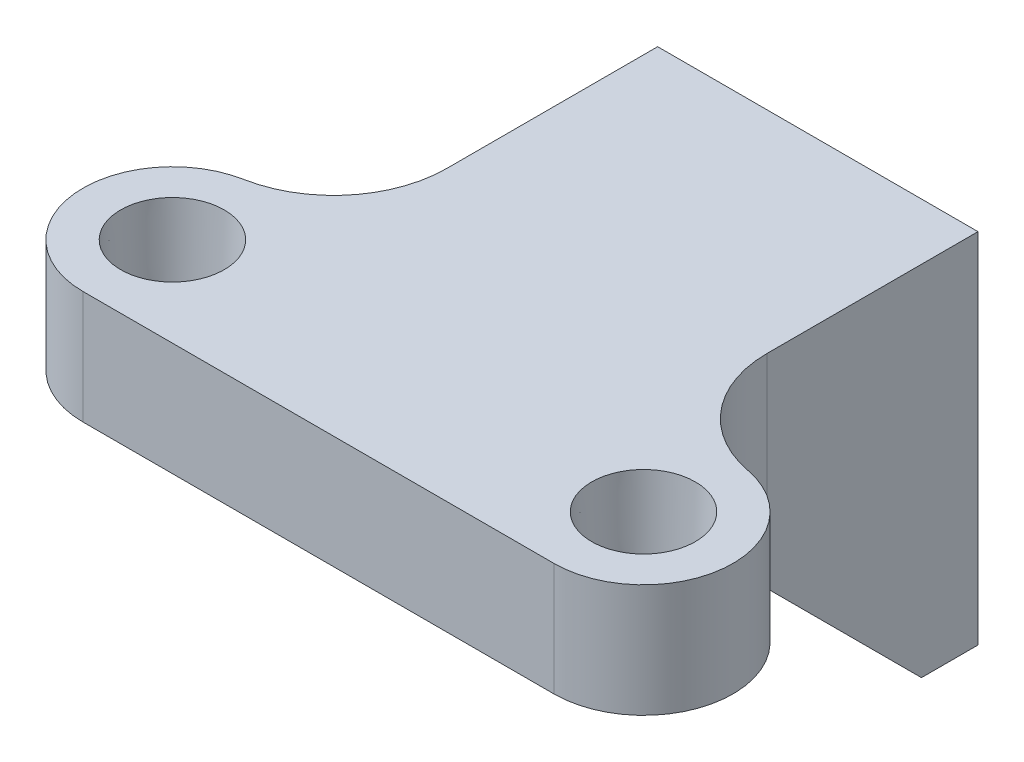
ISO-10303-21;
HEADER;
FILE_DESCRIPTION(('STEP AP214'),'2;1');
FILE_NAME('part.step','',(''),(''),'','','');
FILE_SCHEMA(('AUTOMOTIVE_DESIGN { 1 0 10303 214 1 1 1 1 }'));
ENDSEC;
DATA;
#1=APPLICATION_CONTEXT('core data for automotive mechanical design processes');
#2=APPLICATION_PROTOCOL_DEFINITION('international standard','automotive_design',2000,#1);
#3=PRODUCT_CONTEXT('',#1,'mechanical');
#4=PRODUCT('Part','Part','',(#3));
#5=PRODUCT_RELATED_PRODUCT_CATEGORY('part','',(#4));
#6=PRODUCT_DEFINITION_FORMATION('','',#4);
#7=PRODUCT_DEFINITION_CONTEXT('part definition',#1,'design');
#8=PRODUCT_DEFINITION('design','',#6,#7);
#9=PRODUCT_DEFINITION_SHAPE('','',#8);
#10=(LENGTH_UNIT() NAMED_UNIT(*) SI_UNIT(.MILLI.,.METRE.));
#11=(NAMED_UNIT(*) PLANE_ANGLE_UNIT() SI_UNIT($,.RADIAN.));
#12=(NAMED_UNIT(*) SI_UNIT($,.STERADIAN.) SOLID_ANGLE_UNIT());
#13=UNCERTAINTY_MEASURE_WITH_UNIT(LENGTH_MEASURE(1.E-05),#10,'distance_accuracy_value','');
#14=(GEOMETRIC_REPRESENTATION_CONTEXT(3) GLOBAL_UNCERTAINTY_ASSIGNED_CONTEXT((#13)) GLOBAL_UNIT_ASSIGNED_CONTEXT((#10,
#11,#12)) REPRESENTATION_CONTEXT('',''));
#15=CARTESIAN_POINT('',(0.,0.,0.));
#16=DIRECTION('',(0.,0.,1.));
#17=DIRECTION('',(1.,0.,0.));
#18=AXIS2_PLACEMENT_3D('',#15,#16,#17);
#19=CARTESIAN_POINT('',(-12.5,0.,4.75));
#20=DIRECTION('',(0.,1.,0.));
#21=DIRECTION('',(0.,0.,1.));
#22=AXIS2_PLACEMENT_3D('',#19,#20,#21);
#23=PLANE('',#22);
#24=CARTESIAN_POINT('',(-12.5,0.,4.75));
#25=DIRECTION('',(0.,1.,0.));
#26=DIRECTION('',(0.,0.,1.));
#27=AXIS2_PLACEMENT_3D('',#24,#25,#26);
#28=CIRCLE('',#27,4.74999999999999);
#29=CARTESIAN_POINT('',(-13.3837209302326,0.,0.0829305428921593));
#30=VERTEX_POINT('',#29);
#31=CARTESIAN_POINT('',(-12.5,0.,9.49999999999999));
#32=VERTEX_POINT('',#31);
#33=EDGE_CURVE('E239',#30,#32,#28,.T.);
#34=ORIENTED_EDGE('',*,*,#33,.F.);
#35=CARTESIAN_POINT('',(-14.5,0.,-5.8123150871388));
#36=DIRECTION('',(0.,1.,0.));
#37=DIRECTION('',(0.,0.,1.));
#38=AXIS2_PLACEMENT_3D('',#35,#36,#37);
#39=CIRCLE('',#38,6.);
#40=CARTESIAN_POINT('',(-12.4549994378833,0.,-0.171572875253678));
#41=VERTEX_POINT('',#40);
#42=EDGE_CURVE('E339',#30,#41,#39,.T.);
#43=ORIENTED_EDGE('',*,*,#42,.T.);
#44=DIRECTION('',(1.,0.,0.));
#45=VECTOR('',#44,1.);
#46=CARTESIAN_POINT('',(-12.5,0.,-0.171572875253678));
#47=LINE('',#46,#45);
#48=CARTESIAN_POINT('',(-4.5,0.,-0.171572875253678));
#49=VERTEX_POINT('',#48);
#50=EDGE_CURVE('E288',#41,#49,#47,.T.);
#51=ORIENTED_EDGE('',*,*,#50,.T.);
#52=DIRECTION('',(0.,0.,1.));
#53=VECTOR('',#52,1.);
#54=CARTESIAN_POINT('',(-4.5,0.,4.75));
#55=LINE('',#54,#53);
#56=CARTESIAN_POINT('',(-4.5,0.,-12.));
#57=VERTEX_POINT('',#56);
#58=EDGE_CURVE('E286',#49,#57,#55,.F.);
#59=ORIENTED_EDGE('',*,*,#58,.T.);
#60=DIRECTION('',(1.,0.,0.));
#61=VECTOR('',#60,1.);
#62=CARTESIAN_POINT('',(6.5,0.,-12.));
#63=LINE('',#62,#61);
#64=CARTESIAN_POINT('',(4.5,0.,-12.));
#65=VERTEX_POINT('',#64);
#66=EDGE_CURVE('E281',#57,#65,#63,.T.);
#67=ORIENTED_EDGE('',*,*,#66,.T.);
#68=DIRECTION('',(0.,0.,1.));
#69=VECTOR('',#68,1.);
#70=CARTESIAN_POINT('',(4.5,0.,4.75));
#71=LINE('',#70,#69);
#72=CARTESIAN_POINT('',(4.5,0.,-0.171572875253677));
#73=VERTEX_POINT('',#72);
#74=EDGE_CURVE('E283',#65,#73,#71,.T.);
#75=ORIENTED_EDGE('',*,*,#74,.T.);
#76=DIRECTION('',(-1.,0.,0.));
#77=VECTOR('',#76,1.);
#78=CARTESIAN_POINT('',(8.5,0.,-0.171572875253677));
#79=LINE('',#78,#77);
#80=CARTESIAN_POINT('',(12.4549994378834,0.,-0.171572875253677));
#81=VERTEX_POINT('',#80);
#82=EDGE_CURVE('E52',#73,#81,#79,.F.);
#83=ORIENTED_EDGE('',*,*,#82,.T.);
#84=CARTESIAN_POINT('',(14.5,0.,-5.81231508713881));
#85=DIRECTION('',(0.,1.,0.));
#86=DIRECTION('',(0.,0.,1.));
#87=AXIS2_PLACEMENT_3D('',#84,#85,#86);
#88=CIRCLE('',#87,6.);
#89=CARTESIAN_POINT('',(13.3837209302326,0.,0.0829305428921515));
#90=VERTEX_POINT('',#89);
#91=EDGE_CURVE('E45',#81,#90,#88,.T.);
#92=ORIENTED_EDGE('',*,*,#91,.T.);
#93=CARTESIAN_POINT('',(12.5,0.,4.74999999999999));
#94=DIRECTION('',(0.,1.,0.));
#95=DIRECTION('',(0.,0.,1.));
#96=AXIS2_PLACEMENT_3D('',#93,#94,#95);
#97=CIRCLE('',#96,4.74999999999999);
#98=CARTESIAN_POINT('',(12.5,0.,9.49999999999998));
#99=VERTEX_POINT('',#98);
#100=EDGE_CURVE('E243',#99,#90,#97,.T.);
#101=ORIENTED_EDGE('',*,*,#100,.F.);
#102=DIRECTION('',(1.,0.,0.));
#103=VECTOR('',#102,1.);
#104=CARTESIAN_POINT('',(-12.5,0.,9.49999999999999));
#105=LINE('',#104,#103);
#106=EDGE_CURVE('E254',#32,#99,#105,.T.);
#107=ORIENTED_EDGE('',*,*,#106,.F.);
#108=EDGE_LOOP('',(#34,#43,#51,#59,#67,#75,#83,#92,#101,#107));
#109=FACE_BOUND('',#108,.T.);
#110=CARTESIAN_POINT('',(-12.5,0.,4.75));
#111=DIRECTION('',(0.,1.,0.));
#112=DIRECTION('',(0.,0.,1.));
#113=AXIS2_PLACEMENT_3D('',#110,#111,#112);
#114=CIRCLE('',#113,1.6);
#115=CARTESIAN_POINT('',(-12.5,0.,6.35));
#116=VERTEX_POINT('',#115);
#117=EDGE_CURVE('E232',#116,#116,#114,.T.);
#118=ORIENTED_EDGE('',*,*,#117,.T.);
#119=EDGE_LOOP('',(#118));
#120=FACE_BOUND('',#119,.T.);
#121=CARTESIAN_POINT('',(12.5,0.,4.74999999999999));
#122=DIRECTION('',(0.,1.,0.));
#123=DIRECTION('',(0.,0.,1.));
#124=AXIS2_PLACEMENT_3D('',#121,#122,#123);
#125=CIRCLE('',#124,1.6);
#126=CARTESIAN_POINT('',(12.5,0.,6.34999999999999));
#127=VERTEX_POINT('',#126);
#128=EDGE_CURVE('E235',#127,#127,#125,.T.);
#129=ORIENTED_EDGE('',*,*,#128,.T.);
#130=EDGE_LOOP('',(#129));
#131=FACE_BOUND('',#130,.T.);
#132=ADVANCED_FACE('F36',(#109,#120,#131),#23,.F.);
#133=CARTESIAN_POINT('',(-12.5,6.,4.75));
#134=DIRECTION('',(0.,-1.,0.));
#135=DIRECTION('',(0.,0.,-1.));
#136=AXIS2_PLACEMENT_3D('',#133,#134,#135);
#137=CYLINDRICAL_SURFACE('',#136,4.74999999999999);
#138=CARTESIAN_POINT('',(-12.5,6.,4.75));
#139=DIRECTION('',(0.,1.,0.));
#140=DIRECTION('',(0.,0.,1.));
#141=AXIS2_PLACEMENT_3D('',#138,#139,#140);
#142=CIRCLE('',#141,4.74999999999999);
#143=CARTESIAN_POINT('',(-13.3837209302326,6.,0.0829305428921593));
#144=VERTEX_POINT('',#143);
#145=CARTESIAN_POINT('',(-12.5,6.,9.49999999999999));
#146=VERTEX_POINT('',#145);
#147=EDGE_CURVE('E240',#144,#146,#142,.T.);
#148=ORIENTED_EDGE('',*,*,#147,.F.);
#149=DIRECTION('',(0.,-1.,0.));
#150=VECTOR('',#149,1.);
#151=CARTESIAN_POINT('',(-13.3837209302326,6.,0.0829305428921593));
#152=LINE('',#151,#150);
#153=EDGE_CURVE('E307',#144,#30,#152,.T.);
#154=ORIENTED_EDGE('',*,*,#153,.T.);
#155=ORIENTED_EDGE('',*,*,#33,.T.);
#156=DIRECTION('',(0.,-1.,0.));
#157=VECTOR('',#156,1.);
#158=CARTESIAN_POINT('',(-12.5,6.,9.49999999999999));
#159=LINE('',#158,#157);
#160=EDGE_CURVE('E262',#146,#32,#159,.T.);
#161=ORIENTED_EDGE('',*,*,#160,.F.);
#162=EDGE_LOOP('',(#148,#154,#155,#161));
#163=FACE_BOUND('',#162,.T.);
#164=ADVANCED_FACE('F409',(#163),#137,.T.);
#165=CARTESIAN_POINT('',(-12.5,6.,9.49999999999999));
#166=DIRECTION('',(0.,0.,-1.));
#167=DIRECTION('',(-1.,0.,0.));
#168=AXIS2_PLACEMENT_3D('',#165,#166,#167);
#169=PLANE('',#168);
#170=ORIENTED_EDGE('',*,*,#106,.T.);
#171=DIRECTION('',(0.,-1.,0.));
#172=VECTOR('',#171,1.);
#173=CARTESIAN_POINT('',(12.5,6.,9.49999999999998));
#174=LINE('',#173,#172);
#175=CARTESIAN_POINT('',(12.5,6.,9.49999999999998));
#176=VERTEX_POINT('',#175);
#177=EDGE_CURVE('E259',#176,#99,#174,.T.);
#178=ORIENTED_EDGE('',*,*,#177,.F.);
#179=DIRECTION('',(1.,0.,0.));
#180=VECTOR('',#179,1.);
#181=CARTESIAN_POINT('',(-12.5,6.,9.49999999999999));
#182=LINE('',#181,#180);
#183=EDGE_CURVE('E242',#146,#176,#182,.T.);
#184=ORIENTED_EDGE('',*,*,#183,.F.);
#185=ORIENTED_EDGE('',*,*,#160,.T.);
#186=EDGE_LOOP('',(#170,#178,#184,#185));
#187=FACE_BOUND('',#186,.T.);
#188=ADVANCED_FACE('F412',(#187),#169,.F.);
#189=CARTESIAN_POINT('',(12.5,6.,4.74999999999999));
#190=DIRECTION('',(0.,-1.,0.));
#191=DIRECTION('',(0.,0.,-1.));
#192=AXIS2_PLACEMENT_3D('',#189,#190,#191);
#193=CYLINDRICAL_SURFACE('',#192,4.74999999999999);
#194=ORIENTED_EDGE('',*,*,#100,.T.);
#195=DIRECTION('',(0.,-1.,0.));
#196=VECTOR('',#195,1.);
#197=CARTESIAN_POINT('',(13.3837209302326,6.,0.0829305428921507));
#198=LINE('',#197,#196);
#199=CARTESIAN_POINT('',(13.3837209302326,6.,0.0829305428921515));
#200=VERTEX_POINT('',#199);
#201=EDGE_CURVE('E337',#90,#200,#198,.F.);
#202=ORIENTED_EDGE('',*,*,#201,.T.);
#203=CARTESIAN_POINT('',(12.5,6.,4.74999999999999));
#204=DIRECTION('',(0.,1.,0.));
#205=DIRECTION('',(0.,0.,1.));
#206=AXIS2_PLACEMENT_3D('',#203,#204,#205);
#207=CIRCLE('',#206,4.74999999999999);
#208=EDGE_CURVE('E245',#176,#200,#207,.T.);
#209=ORIENTED_EDGE('',*,*,#208,.F.);
#210=ORIENTED_EDGE('',*,*,#177,.T.);
#211=EDGE_LOOP('',(#194,#202,#209,#210));
#212=FACE_BOUND('',#211,.T.);
#213=ADVANCED_FACE('F385',(#212),#193,.T.);
#214=CARTESIAN_POINT('',(8.5,6.,0.));
#215=DIRECTION('',(-1.,0.,0.));
#216=DIRECTION('',(0.,0.,1.));
#217=AXIS2_PLACEMENT_3D('',#214,#215,#216);
#218=PLANE('',#217);
#219=DIRECTION('',(0.,0.,-1.));
#220=VECTOR('',#219,1.);
#221=CARTESIAN_POINT('',(8.5,6.,0.));
#222=LINE('',#221,#220);
#223=CARTESIAN_POINT('',(8.5,6.,-5.81231508713881));
#224=VERTEX_POINT('',#223);
#225=CARTESIAN_POINT('',(8.5,6.,-17.));
#226=VERTEX_POINT('',#225);
#227=EDGE_CURVE('E248',#224,#226,#222,.T.);
#228=ORIENTED_EDGE('',*,*,#227,.F.);
#229=DIRECTION('',(0.,1.,0.));
#230=VECTOR('',#229,1.);
#231=CARTESIAN_POINT('',(8.5,0.,-5.81231508713881));
#232=LINE('',#231,#230);
#233=CARTESIAN_POINT('',(8.5,-4.81231508713889,-5.81231508713881));
#234=VERTEX_POINT('',#233);
#235=EDGE_CURVE('E334',#224,#234,#232,.F.);
#236=ORIENTED_EDGE('',*,*,#235,.T.);
#237=DIRECTION('',(0.,-0.707106781186544,-0.707106781186551));
#238=VECTOR('',#237,1.);
#239=CARTESIAN_POINT('',(8.5,-13.,-14.));
#240=LINE('',#239,#238);
#241=CARTESIAN_POINT('',(8.5,-13.,-14.));
#242=VERTEX_POINT('',#241);
#243=EDGE_CURVE('E205',#234,#242,#240,.T.);
#244=ORIENTED_EDGE('',*,*,#243,.T.);
#245=DIRECTION('',(0.,0.,-1.));
#246=VECTOR('',#245,1.);
#247=CARTESIAN_POINT('',(8.5,-13.,-17.));
#248=LINE('',#247,#246);
#249=CARTESIAN_POINT('',(8.5,-13.,-17.));
#250=VERTEX_POINT('',#249);
#251=EDGE_CURVE('E207',#242,#250,#248,.T.);
#252=ORIENTED_EDGE('',*,*,#251,.T.);
#253=DIRECTION('',(0.,-1.,0.));
#254=VECTOR('',#253,1.);
#255=CARTESIAN_POINT('',(8.5,6.,-17.));
#256=LINE('',#255,#254);
#257=EDGE_CURVE('E178',#226,#250,#256,.T.);
#258=ORIENTED_EDGE('',*,*,#257,.F.);
#259=EDGE_LOOP('',(#228,#236,#244,#252,#258));
#260=FACE_BOUND('',#259,.T.);
#261=ADVANCED_FACE('F394',(#260),#218,.F.);
#262=CARTESIAN_POINT('',(-8.5,6.,-17.));
#263=DIRECTION('',(0.,0.,1.));
#264=DIRECTION('',(1.,0.,0.));
#265=AXIS2_PLACEMENT_3D('',#262,#263,#264);
#266=PLANE('',#265);
#267=DIRECTION('',(-1.,0.,0.));
#268=VECTOR('',#267,1.);
#269=CARTESIAN_POINT('',(6.5,-13.,-17.));
#270=LINE('',#269,#268);
#271=CARTESIAN_POINT('',(-8.5,-13.,-17.));
#272=VERTEX_POINT('',#271);
#273=EDGE_CURVE('E181',#250,#272,#270,.T.);
#274=ORIENTED_EDGE('',*,*,#273,.T.);
#275=DIRECTION('',(0.,-1.,0.));
#276=VECTOR('',#275,1.);
#277=CARTESIAN_POINT('',(-8.5,6.,-17.));
#278=LINE('',#277,#276);
#279=CARTESIAN_POINT('',(-8.5,6.,-17.));
#280=VERTEX_POINT('',#279);
#281=EDGE_CURVE('E168',#280,#272,#278,.T.);
#282=ORIENTED_EDGE('',*,*,#281,.F.);
#283=DIRECTION('',(-1.,0.,0.));
#284=VECTOR('',#283,1.);
#285=CARTESIAN_POINT('',(-8.5,6.,-17.));
#286=LINE('',#285,#284);
#287=EDGE_CURVE('E250',#226,#280,#286,.T.);
#288=ORIENTED_EDGE('',*,*,#287,.F.);
#289=ORIENTED_EDGE('',*,*,#257,.T.);
#290=EDGE_LOOP('',(#274,#282,#288,#289));
#291=FACE_BOUND('',#290,.T.);
#292=CARTESIAN_POINT('',(0.,-6.5,-17.));
#293=DIRECTION('',(0.,0.,1.));
#294=DIRECTION('',(1.,0.,0.));
#295=AXIS2_PLACEMENT_3D('',#292,#293,#294);
#296=CIRCLE('',#295,2.65);
#297=CARTESIAN_POINT('',(2.65,-6.5,-17.));
#298=VERTEX_POINT('',#297);
#299=EDGE_CURVE('E189',#298,#298,#296,.T.);
#300=ORIENTED_EDGE('',*,*,#299,.T.);
#301=EDGE_LOOP('',(#300));
#302=FACE_BOUND('',#301,.T.);
#303=ADVANCED_FACE('F182',(#291,#302),#266,.F.);
#304=CARTESIAN_POINT('',(-8.5,6.,0.));
#305=DIRECTION('',(1.,0.,0.));
#306=DIRECTION('',(0.,0.,-1.));
#307=AXIS2_PLACEMENT_3D('',#304,#305,#306);
#308=PLANE('',#307);
#309=DIRECTION('',(0.,-0.707106781186544,-0.707106781186551));
#310=VECTOR('',#309,1.);
#311=CARTESIAN_POINT('',(-8.5,-13.,-14.));
#312=LINE('',#311,#310);
#313=CARTESIAN_POINT('',(-8.5,-4.81231508713888,-5.8123150871388));
#314=VERTEX_POINT('',#313);
#315=CARTESIAN_POINT('',(-8.5,-13.,-14.));
#316=VERTEX_POINT('',#315);
#317=EDGE_CURVE('E195',#314,#316,#312,.T.);
#318=ORIENTED_EDGE('',*,*,#317,.F.);
#319=DIRECTION('',(0.,1.,0.));
#320=VECTOR('',#319,1.);
#321=CARTESIAN_POINT('',(-8.5,6.,-5.8123150871388));
#322=LINE('',#321,#320);
#323=CARTESIAN_POINT('',(-8.5,6.,-5.8123150871388));
#324=VERTEX_POINT('',#323);
#325=EDGE_CURVE('E332',#314,#324,#322,.T.);
#326=ORIENTED_EDGE('',*,*,#325,.T.);
#327=DIRECTION('',(0.,0.,1.));
#328=VECTOR('',#327,1.);
#329=CARTESIAN_POINT('',(-8.5,6.,0.));
#330=LINE('',#329,#328);
#331=EDGE_CURVE('E175',#280,#324,#330,.T.);
#332=ORIENTED_EDGE('',*,*,#331,.F.);
#333=ORIENTED_EDGE('',*,*,#281,.T.);
#334=DIRECTION('',(0.,0.,-1.));
#335=VECTOR('',#334,1.);
#336=CARTESIAN_POINT('',(-8.5,-13.,-17.));
#337=LINE('',#336,#335);
#338=EDGE_CURVE('E173',#316,#272,#337,.T.);
#339=ORIENTED_EDGE('',*,*,#338,.F.);
#340=EDGE_LOOP('',(#318,#326,#332,#333,#339));
#341=FACE_BOUND('',#340,.T.);
#342=ADVANCED_FACE('F171',(#341),#308,.F.);
#343=CARTESIAN_POINT('',(-12.5,6.,4.75));
#344=DIRECTION('',(0.,1.,0.));
#345=DIRECTION('',(0.,0.,1.));
#346=AXIS2_PLACEMENT_3D('',#343,#344,#345);
#347=PLANE('',#346);
#348=CARTESIAN_POINT('',(12.5,6.,4.74999999999999));
#349=DIRECTION('',(0.,-1.,0.));
#350=DIRECTION('',(0.,0.,-1.));
#351=AXIS2_PLACEMENT_3D('',#348,#349,#350);
#352=CIRCLE('',#351,2.75);
#353=CARTESIAN_POINT('',(12.5,6.,1.99999999999999));
#354=VERTEX_POINT('',#353);
#355=EDGE_CURVE('E220',#354,#354,#352,.T.);
#356=ORIENTED_EDGE('',*,*,#355,.T.);
#357=EDGE_LOOP('',(#356));
#358=FACE_BOUND('',#357,.T.);
#359=CARTESIAN_POINT('',(-12.5,6.,4.75));
#360=DIRECTION('',(0.,-1.,0.));
#361=DIRECTION('',(0.,0.,-1.));
#362=AXIS2_PLACEMENT_3D('',#359,#360,#361);
#363=CIRCLE('',#362,2.75);
#364=CARTESIAN_POINT('',(-12.5,6.,2.));
#365=VERTEX_POINT('',#364);
#366=EDGE_CURVE('E218',#365,#365,#363,.T.);
#367=ORIENTED_EDGE('',*,*,#366,.T.);
#368=EDGE_LOOP('',(#367));
#369=FACE_BOUND('',#368,.T.);
#370=ORIENTED_EDGE('',*,*,#331,.T.);
#371=CARTESIAN_POINT('',(-14.5,6.,-5.8123150871388));
#372=DIRECTION('',(0.,1.,0.));
#373=DIRECTION('',(0.,0.,1.));
#374=AXIS2_PLACEMENT_3D('',#371,#372,#373);
#375=CIRCLE('',#374,6.);
#376=EDGE_CURVE('E397',#324,#144,#375,.F.);
#377=ORIENTED_EDGE('',*,*,#376,.T.);
#378=ORIENTED_EDGE('',*,*,#147,.T.);
#379=ORIENTED_EDGE('',*,*,#183,.T.);
#380=ORIENTED_EDGE('',*,*,#208,.T.);
#381=CARTESIAN_POINT('',(14.5,6.,-5.81231508713881));
#382=DIRECTION('',(0.,1.,0.));
#383=DIRECTION('',(0.,0.,1.));
#384=AXIS2_PLACEMENT_3D('',#381,#382,#383);
#385=CIRCLE('',#384,6.);
#386=EDGE_CURVE('E11',#200,#224,#385,.F.);
#387=ORIENTED_EDGE('',*,*,#386,.T.);
#388=ORIENTED_EDGE('',*,*,#227,.T.);
#389=ORIENTED_EDGE('',*,*,#287,.T.);
#390=EDGE_LOOP('',(#370,#377,#378,#379,#380,#387,#388,#389));
#391=FACE_BOUND('',#390,.T.);
#392=ADVANCED_FACE('F392',(#358,#369,#391),#347,.T.);
#393=CARTESIAN_POINT('',(12.5,6.,4.74999999999999));
#394=DIRECTION('',(0.,1.,0.));
#395=DIRECTION('',(0.,0.,1.));
#396=AXIS2_PLACEMENT_3D('',#393,#394,#395);
#397=CYLINDRICAL_SURFACE('',#396,1.6);
#398=CARTESIAN_POINT('',(12.5,2.2,4.74999999999999));
#399=DIRECTION('',(0.,-1.,0.));
#400=DIRECTION('',(0.,0.,-1.));
#401=AXIS2_PLACEMENT_3D('',#398,#399,#400);
#402=CIRCLE('',#401,1.6);
#403=CARTESIAN_POINT('',(12.5,2.2,3.14999999999999));
#404=VERTEX_POINT('',#403);
#405=EDGE_CURVE('E236',#404,#404,#402,.F.);
#406=ORIENTED_EDGE('',*,*,#405,.T.);
#407=EDGE_LOOP('',(#406));
#408=FACE_BOUND('',#407,.T.);
#409=ORIENTED_EDGE('',*,*,#128,.F.);
#410=EDGE_LOOP('',(#409));
#411=FACE_BOUND('',#410,.T.);
#412=ADVANCED_FACE('F455',(#408,#411),#397,.F.);
#413=CARTESIAN_POINT('',(-12.5,6.,4.75));
#414=DIRECTION('',(0.,1.,0.));
#415=DIRECTION('',(0.,0.,1.));
#416=AXIS2_PLACEMENT_3D('',#413,#414,#415);
#417=CYLINDRICAL_SURFACE('',#416,1.6);
#418=CARTESIAN_POINT('',(-12.5,2.2,4.75));
#419=DIRECTION('',(0.,-1.,0.));
#420=DIRECTION('',(0.,0.,-1.));
#421=AXIS2_PLACEMENT_3D('',#418,#419,#420);
#422=CIRCLE('',#421,1.6);
#423=CARTESIAN_POINT('',(-12.5,2.2,3.15));
#424=VERTEX_POINT('',#423);
#425=EDGE_CURVE('E227',#424,#424,#422,.F.);
#426=ORIENTED_EDGE('',*,*,#425,.T.);
#427=EDGE_LOOP('',(#426));
#428=FACE_BOUND('',#427,.T.);
#429=ORIENTED_EDGE('',*,*,#117,.F.);
#430=EDGE_LOOP('',(#429));
#431=FACE_BOUND('',#430,.T.);
#432=ADVANCED_FACE('F464',(#428,#431),#417,.F.);
#433=CARTESIAN_POINT('',(-12.5,2.2,4.75));
#434=DIRECTION('',(0.,-1.,0.));
#435=DIRECTION('',(0.,0.,-1.));
#436=AXIS2_PLACEMENT_3D('',#433,#434,#435);
#437=PLANE('',#436);
#438=CARTESIAN_POINT('',(-12.5,2.2,4.75));
#439=DIRECTION('',(0.,-1.,0.));
#440=DIRECTION('',(0.,0.,-1.));
#441=AXIS2_PLACEMENT_3D('',#438,#439,#440);
#442=CIRCLE('',#441,2.55085043872444);
#443=CARTESIAN_POINT('',(-12.5,2.2,2.19914956127556));
#444=VERTEX_POINT('',#443);
#445=EDGE_CURVE('E224',#444,#444,#442,.T.);
#446=ORIENTED_EDGE('',*,*,#445,.F.);
#447=EDGE_LOOP('',(#446));
#448=FACE_BOUND('',#447,.T.);
#449=ORIENTED_EDGE('',*,*,#425,.F.);
#450=EDGE_LOOP('',(#449));
#451=FACE_BOUND('',#450,.T.);
#452=ADVANCED_FACE('F471',(#448,#451),#437,.F.);
#453=CARTESIAN_POINT('',(-12.5,6.,4.75));
#454=DIRECTION('',(0.,1.,0.));
#455=DIRECTION('',(0.,0.,-1.));
#456=AXIS2_PLACEMENT_3D('',#453,#454,#455);
#457=CONICAL_SURFACE('',#456,2.75,0.05235987755983);
#458=ORIENTED_EDGE('',*,*,#445,.T.);
#459=EDGE_LOOP('',(#458));
#460=FACE_BOUND('',#459,.T.);
#461=ORIENTED_EDGE('',*,*,#366,.F.);
#462=EDGE_LOOP('',(#461));
#463=FACE_BOUND('',#462,.T.);
#464=ADVANCED_FACE('F479',(#460,#463),#457,.F.);
#465=CARTESIAN_POINT('',(12.5,2.2,4.74999999999999));
#466=DIRECTION('',(0.,-1.,0.));
#467=DIRECTION('',(0.,0.,-1.));
#468=AXIS2_PLACEMENT_3D('',#465,#466,#467);
#469=PLANE('',#468);
#470=CARTESIAN_POINT('',(12.5,2.2,4.74999999999999));
#471=DIRECTION('',(0.,-1.,0.));
#472=DIRECTION('',(0.,0.,-1.));
#473=AXIS2_PLACEMENT_3D('',#470,#471,#472);
#474=CIRCLE('',#473,2.55085043872444);
#475=CARTESIAN_POINT('',(12.5,2.2,2.19914956127555));
#476=VERTEX_POINT('',#475);
#477=EDGE_CURVE('E223',#476,#476,#474,.T.);
#478=ORIENTED_EDGE('',*,*,#477,.F.);
#479=EDGE_LOOP('',(#478));
#480=FACE_BOUND('',#479,.T.);
#481=ORIENTED_EDGE('',*,*,#405,.F.);
#482=EDGE_LOOP('',(#481));
#483=FACE_BOUND('',#482,.T.);
#484=ADVANCED_FACE('F488',(#480,#483),#469,.F.);
#485=CARTESIAN_POINT('',(12.5,6.,4.74999999999999));
#486=DIRECTION('',(0.,1.,0.));
#487=DIRECTION('',(0.,0.,-1.));
#488=AXIS2_PLACEMENT_3D('',#485,#486,#487);
#489=CONICAL_SURFACE('',#488,2.75,0.05235987755983);
#490=ORIENTED_EDGE('',*,*,#477,.T.);
#491=EDGE_LOOP('',(#490));
#492=FACE_BOUND('',#491,.T.);
#493=ORIENTED_EDGE('',*,*,#355,.F.);
#494=EDGE_LOOP('',(#493));
#495=FACE_BOUND('',#494,.T.);
#496=ADVANCED_FACE('F497',(#492,#495),#489,.F.);
#497=CARTESIAN_POINT('',(6.5,-13.,-14.));
#498=DIRECTION('',(0.,-1.,0.));
#499=DIRECTION('',(0.,0.,-1.));
#500=AXIS2_PLACEMENT_3D('',#497,#498,#499);
#501=PLANE('',#500);
#502=ORIENTED_EDGE('',*,*,#273,.F.);
#503=ORIENTED_EDGE('',*,*,#251,.F.);
#504=DIRECTION('',(-1.,0.,0.));
#505=VECTOR('',#504,1.);
#506=CARTESIAN_POINT('',(8.5,-13.,-14.));
#507=LINE('',#506,#505);
#508=CARTESIAN_POINT('',(4.5,-13.,-14.));
#509=VERTEX_POINT('',#508);
#510=EDGE_CURVE('E209',#242,#509,#507,.T.);
#511=ORIENTED_EDGE('',*,*,#510,.T.);
#512=DIRECTION('',(-1.,0.,0.));
#513=VECTOR('',#512,1.);
#514=CARTESIAN_POINT('',(6.5,-13.,-14.));
#515=LINE('',#514,#513);
#516=CARTESIAN_POINT('',(-4.5,-13.,-14.));
#517=VERTEX_POINT('',#516);
#518=EDGE_CURVE('E188',#509,#517,#515,.T.);
#519=ORIENTED_EDGE('',*,*,#518,.T.);
#520=DIRECTION('',(1.,0.,0.));
#521=VECTOR('',#520,1.);
#522=CARTESIAN_POINT('',(-8.5,-13.,-14.));
#523=LINE('',#522,#521);
#524=EDGE_CURVE('E194',#316,#517,#523,.T.);
#525=ORIENTED_EDGE('',*,*,#524,.F.);
#526=ORIENTED_EDGE('',*,*,#338,.T.);
#527=EDGE_LOOP('',(#502,#503,#511,#519,#525,#526));
#528=FACE_BOUND('',#527,.T.);
#529=ADVANCED_FACE('F192',(#528),#501,.T.);
#530=CARTESIAN_POINT('',(0.,0.,-14.));
#531=DIRECTION('',(0.,0.,-1.));
#532=DIRECTION('',(-1.,0.,0.));
#533=AXIS2_PLACEMENT_3D('',#530,#531,#532);
#534=PLANE('',#533);
#535=CARTESIAN_POINT('',(0.,-6.5,-14.));
#536=DIRECTION('',(0.,0.,1.));
#537=DIRECTION('',(1.,0.,0.));
#538=AXIS2_PLACEMENT_3D('',#535,#536,#537);
#539=CIRCLE('',#538,2.65);
#540=CARTESIAN_POINT('',(2.65,-6.5,-14.));
#541=VERTEX_POINT('',#540);
#542=EDGE_CURVE('E213',#541,#541,#539,.T.);
#543=ORIENTED_EDGE('',*,*,#542,.F.);
#544=EDGE_LOOP('',(#543));
#545=FACE_BOUND('',#544,.T.);
#546=DIRECTION('',(1.,0.,0.));
#547=VECTOR('',#546,1.);
#548=CARTESIAN_POINT('',(-6.5,-2.,-14.));
#549=LINE('',#548,#547);
#550=CARTESIAN_POINT('',(4.5,-2.,-14.));
#551=VERTEX_POINT('',#550);
#552=CARTESIAN_POINT('',(-4.5,-2.,-14.));
#553=VERTEX_POINT('',#552);
#554=EDGE_CURVE('E274',#551,#553,#549,.F.);
#555=ORIENTED_EDGE('',*,*,#554,.T.);
#556=DIRECTION('',(0.,1.,0.));
#557=VECTOR('',#556,1.);
#558=CARTESIAN_POINT('',(-4.5,0.,-14.));
#559=LINE('',#558,#557);
#560=EDGE_CURVE('E278',#553,#517,#559,.F.);
#561=ORIENTED_EDGE('',*,*,#560,.T.);
#562=ORIENTED_EDGE('',*,*,#518,.F.);
#563=DIRECTION('',(0.,-1.,0.));
#564=VECTOR('',#563,1.);
#565=CARTESIAN_POINT('',(4.5,0.,-14.));
#566=LINE('',#565,#564);
#567=EDGE_CURVE('E276',#509,#551,#566,.F.);
#568=ORIENTED_EDGE('',*,*,#567,.T.);
#569=EDGE_LOOP('',(#555,#561,#562,#568));
#570=FACE_BOUND('',#569,.T.);
#571=ADVANCED_FACE('F515',(#545,#570),#534,.F.);
#572=CARTESIAN_POINT('',(0.,-6.5,-14.));
#573=DIRECTION('',(0.,0.,1.));
#574=DIRECTION('',(1.,0.,0.));
#575=AXIS2_PLACEMENT_3D('',#572,#573,#574);
#576=CYLINDRICAL_SURFACE('',#575,2.65);
#577=ORIENTED_EDGE('',*,*,#542,.T.);
#578=EDGE_LOOP('',(#577));
#579=FACE_BOUND('',#578,.T.);
#580=ORIENTED_EDGE('',*,*,#299,.F.);
#581=EDGE_LOOP('',(#580));
#582=FACE_BOUND('',#581,.T.);
#583=ADVANCED_FACE('F523',(#579,#582),#576,.F.);
#584=CARTESIAN_POINT('',(6.5,0.,0.));
#585=DIRECTION('',(-1.,0.,0.));
#586=DIRECTION('',(0.,-1.,0.));
#587=AXIS2_PLACEMENT_3D('',#584,#585,#586);
#588=PLANE('',#587);
#589=DIRECTION('',(0.,0.,1.));
#590=VECTOR('',#589,1.);
#591=CARTESIAN_POINT('',(6.5,-2.,0.));
#592=LINE('',#591,#590);
#593=CARTESIAN_POINT('',(6.5,-2.,-2.99999999999988));
#594=VERTEX_POINT('',#593);
#595=CARTESIAN_POINT('',(6.5,-2.,-12.));
#596=VERTEX_POINT('',#595);
#597=EDGE_CURVE('E293',#594,#596,#592,.F.);
#598=ORIENTED_EDGE('',*,*,#597,.T.);
#599=DIRECTION('',(0.,-1.,0.));
#600=VECTOR('',#599,1.);
#601=CARTESIAN_POINT('',(6.5,0.,-12.));
#602=LINE('',#601,#600);
#603=CARTESIAN_POINT('',(6.5,-11.,-12.));
#604=VERTEX_POINT('',#603);
#605=EDGE_CURVE('E295',#596,#604,#602,.T.);
#606=ORIENTED_EDGE('',*,*,#605,.T.);
#607=DIRECTION('',(0.,-0.707106781186544,-0.707106781186551));
#608=VECTOR('',#607,1.);
#609=CARTESIAN_POINT('',(6.5,-13.,-14.));
#610=LINE('',#609,#608);
#611=EDGE_CURVE('E204',#594,#604,#610,.T.);
#612=ORIENTED_EDGE('',*,*,#611,.F.);
#613=EDGE_LOOP('',(#598,#606,#612));
#614=FACE_BOUND('',#613,.T.);
#615=ADVANCED_FACE('F533',(#614),#588,.T.);
#616=CARTESIAN_POINT('',(8.5,-13.,-14.));
#617=DIRECTION('',(0.,0.707106781186552,-0.707106781186544));
#618=DIRECTION('',(0.,0.707106781186544,0.707106781186551));
#619=AXIS2_PLACEMENT_3D('',#616,#617,#618);
#620=PLANE('',#619);
#621=ORIENTED_EDGE('',*,*,#243,.F.);
#622=CARTESIAN_POINT('',(14.5,-4.81231508713889,-5.81231508713881));
#623=DIRECTION('',(0.,0.707106781186552,-0.707106781186544));
#624=DIRECTION('',(0.,-0.707106781186544,-0.707106781186551));
#625=AXIS2_PLACEMENT_3D('',#622,#623,#624);
#626=ELLIPSE('',#625,8.48528137423852,6.);
#627=CARTESIAN_POINT('',(10.2413082319973,-0.585786437626896,-1.58578643762676));
#628=VERTEX_POINT('',#627);
#629=EDGE_CURVE('E375',#234,#628,#626,.T.);
#630=ORIENTED_EDGE('',*,*,#629,.T.);
#631=DIRECTION('',(-1.,0.,0.));
#632=VECTOR('',#631,1.);
#633=CARTESIAN_POINT('',(6.5,-0.585786437626896,-1.58578643762677));
#634=LINE('',#633,#632);
#635=CARTESIAN_POINT('',(5.91421356237309,-0.585786437626898,-1.58578643762676));
#636=VERTEX_POINT('',#635);
#637=EDGE_CURVE('E59',#628,#636,#634,.T.);
#638=ORIENTED_EDGE('',*,*,#637,.T.);
#639=CARTESIAN_POINT('',(4.5,-2.,-2.99999999999988));
#640=DIRECTION('',(0.,0.707106781186552,-0.707106781186544));
#641=DIRECTION('',(0.,0.707106781186544,0.707106781186551));
#642=AXIS2_PLACEMENT_3D('',#639,#640,#641);
#643=ELLIPSE('',#642,2.82842712474621,2.);
#644=EDGE_CURVE('E305',#636,#594,#643,.T.);
#645=ORIENTED_EDGE('',*,*,#644,.T.);
#646=ORIENTED_EDGE('',*,*,#611,.T.);
#647=CARTESIAN_POINT('',(4.5,-11.,-12.));
#648=DIRECTION('',(0.,0.707106781186552,-0.707106781186544));
#649=DIRECTION('',(0.,-0.707106781186544,-0.707106781186551));
#650=AXIS2_PLACEMENT_3D('',#647,#648,#649);
#651=ELLIPSE('',#650,2.82842712474617,2.);
#652=EDGE_CURVE('E302',#604,#509,#651,.T.);
#653=ORIENTED_EDGE('',*,*,#652,.T.);
#654=ORIENTED_EDGE('',*,*,#510,.F.);
#655=EDGE_LOOP('',(#621,#630,#638,#645,#646,#653,#654));
#656=FACE_BOUND('',#655,.T.);
#657=ADVANCED_FACE('F541',(#656),#620,.F.);
#658=CARTESIAN_POINT('',(-6.5,0.,0.));
#659=DIRECTION('',(1.,0.,0.));
#660=DIRECTION('',(0.,-1.,0.));
#661=AXIS2_PLACEMENT_3D('',#658,#659,#660);
#662=PLANE('',#661);
#663=DIRECTION('',(0.,-0.707106781186544,-0.707106781186551));
#664=VECTOR('',#663,1.);
#665=CARTESIAN_POINT('',(-6.5,-13.,-14.));
#666=LINE('',#665,#664);
#667=CARTESIAN_POINT('',(-6.5,-2.,-2.99999999999988));
#668=VERTEX_POINT('',#667);
#669=CARTESIAN_POINT('',(-6.5,-11.,-12.));
#670=VERTEX_POINT('',#669);
#671=EDGE_CURVE('E196',#668,#670,#666,.T.);
#672=ORIENTED_EDGE('',*,*,#671,.T.);
#673=DIRECTION('',(0.,1.,0.));
#674=VECTOR('',#673,1.);
#675=CARTESIAN_POINT('',(-6.5,0.,-12.));
#676=LINE('',#675,#674);
#677=CARTESIAN_POINT('',(-6.5,-2.,-12.));
#678=VERTEX_POINT('',#677);
#679=EDGE_CURVE('E271',#670,#678,#676,.T.);
#680=ORIENTED_EDGE('',*,*,#679,.T.);
#681=DIRECTION('',(0.,0.,1.));
#682=VECTOR('',#681,1.);
#683=CARTESIAN_POINT('',(-6.5,-2.,0.));
#684=LINE('',#683,#682);
#685=EDGE_CURVE('E265',#678,#668,#684,.T.);
#686=ORIENTED_EDGE('',*,*,#685,.T.);
#687=EDGE_LOOP('',(#672,#680,#686));
#688=FACE_BOUND('',#687,.T.);
#689=ADVANCED_FACE('F550',(#688),#662,.T.);
#690=CARTESIAN_POINT('',(-8.5,-13.,-14.));
#691=DIRECTION('',(0.,-0.707106781186552,0.707106781186544));
#692=DIRECTION('',(0.,-0.707106781186544,-0.707106781186551));
#693=AXIS2_PLACEMENT_3D('',#690,#691,#692);
#694=PLANE('',#693);
#695=CARTESIAN_POINT('',(-4.5,-2.,-2.99999999999988));
#696=DIRECTION('',(0.,-0.707106781186552,0.707106781186544));
#697=DIRECTION('',(0.,0.707106781186544,0.707106781186551));
#698=AXIS2_PLACEMENT_3D('',#695,#696,#697);
#699=ELLIPSE('',#698,2.82842712474621,2.);
#700=CARTESIAN_POINT('',(-5.91421356237309,-0.585786437626898,-1.58578643762676));
#701=VERTEX_POINT('',#700);
#702=EDGE_CURVE('E299',#668,#701,#699,.F.);
#703=ORIENTED_EDGE('',*,*,#702,.T.);
#704=DIRECTION('',(1.,0.,0.));
#705=VECTOR('',#704,1.);
#706=CARTESIAN_POINT('',(-8.5,-0.5857864376269,-1.58578643762677));
#707=LINE('',#706,#705);
#708=CARTESIAN_POINT('',(-10.2413082319973,-0.5857864376269,-1.58578643762677));
#709=VERTEX_POINT('',#708);
#710=EDGE_CURVE('E290',#701,#709,#707,.F.);
#711=ORIENTED_EDGE('',*,*,#710,.T.);
#712=CARTESIAN_POINT('',(-14.5,-4.81231508713888,-5.8123150871388));
#713=DIRECTION('',(0.,-0.707106781186552,0.707106781186544));
#714=DIRECTION('',(0.,-0.707106781186544,-0.707106781186551));
#715=AXIS2_PLACEMENT_3D('',#712,#713,#714);
#716=ELLIPSE('',#715,8.48528137423852,6.);
#717=EDGE_CURVE('E350',#709,#314,#716,.F.);
#718=ORIENTED_EDGE('',*,*,#717,.T.);
#719=ORIENTED_EDGE('',*,*,#317,.T.);
#720=ORIENTED_EDGE('',*,*,#524,.T.);
#721=CARTESIAN_POINT('',(-4.5,-11.,-12.));
#722=DIRECTION('',(0.,-0.707106781186552,0.707106781186544));
#723=DIRECTION('',(0.,0.707106781186544,0.707106781186551));
#724=AXIS2_PLACEMENT_3D('',#721,#722,#723);
#725=ELLIPSE('',#724,2.82842712474617,2.);
#726=EDGE_CURVE('E297',#517,#670,#725,.F.);
#727=ORIENTED_EDGE('',*,*,#726,.T.);
#728=ORIENTED_EDGE('',*,*,#671,.F.);
#729=EDGE_LOOP('',(#703,#711,#718,#719,#720,#727,#728));
#730=FACE_BOUND('',#729,.T.);
#731=ADVANCED_FACE('F367',(#730),#694,.T.);
#732=CARTESIAN_POINT('',(8.5,-2.,-0.171572875253677));
#733=DIRECTION('',(1.,0.,0.));
#734=DIRECTION('',(0.,0.,-1.));
#735=AXIS2_PLACEMENT_3D('',#732,#733,#734);
#736=CYLINDRICAL_SURFACE('',#735,2.);
#737=ORIENTED_EDGE('',*,*,#637,.F.);
#738=CARTESIAN_POINT('',(10.2413082319973,-0.585786437626897,-1.58578643762676));
#739=CARTESIAN_POINT('',(10.2910193101016,-0.535660031458733,-1.5356531599621));
#740=CARTESIAN_POINT('',(10.3436582426868,-0.489749410494463,-1.48442356556642));
#741=CARTESIAN_POINT('',(10.4539059114697,-0.405888733272787,-1.38120855744339));
#742=CARTESIAN_POINT('',(10.5114992758291,-0.367915224980328,-1.329225869963));
#743=CARTESIAN_POINT('',(10.63022890833,-0.299651827048643,-1.22636000804306));
#744=CARTESIAN_POINT('',(10.6913033654513,-0.26926062906609,-1.1754716942284));
#745=CARTESIAN_POINT('',(10.8171660546454,-0.214699045494493,-1.07488679789264));
#746=CARTESIAN_POINT('',(10.8819573490886,-0.190533882333621,-1.0251912473444));
#747=CARTESIAN_POINT('',(11.0339847203888,-0.14144796193136,-0.913537201257902));
#748=CARTESIAN_POINT('',(11.1222718366193,-0.118348246450195,-0.852211687843031));
#749=CARTESIAN_POINT('',(11.3031565648925,-0.0796225203806654,-0.733742861492995));
#750=CARTESIAN_POINT('',(11.395755138774,-0.0639981863188631,-0.676600489155199));
#751=CARTESIAN_POINT('',(11.5849932613531,-0.0386402613382526,-0.566863541259273));
#752=CARTESIAN_POINT('',(11.6816507740519,-0.0289366586843712,-0.514293255125795));
#753=CARTESIAN_POINT('',(11.8779526330142,-0.0141604644419332,-0.414445889814002));
#754=CARTESIAN_POINT('',(11.9775960210601,-0.00908640325127983,-0.36716713507546));
#755=CARTESIAN_POINT('',(12.1405132873633,-0.00364272844035916,-0.295303285224296));
#756=CARTESIAN_POINT('',(12.203002753896,-0.00221366993409002,-0.268994813544503));
#757=CARTESIAN_POINT('',(12.3285344350452,-0.000396528865629903,-0.21863216350527));
#758=CARTESIAN_POINT('',(12.391572290605,-3.24835495227941E-06,-0.194567315562525));
#759=CARTESIAN_POINT('',(12.4549994378834,0.,-0.17157287525369));
#760=B_SPLINE_CURVE_WITH_KNOTS('',3,(#738,#739,#740,#741,#742,#743,#744,#745,#746,#747,#748,
#749,#750,#751,#752,#753,#754,#755,#756,#757,#758,#759),.UNSPECIFIED.,.F.,.F.,(4,2,2,2,2,2,2,2,
2,2,4),(0.,0.259422611588919,0.51806751108643,0.7730452152312,1.02823610467168,1.35758371913722,
1.68700516281164,2.01808155468276,2.34905281302911,2.55246059908679,2.75484564105593),.UNSPECIFIED.);
#761=EDGE_CURVE('E369',#628,#81,#760,.T.);
#762=ORIENTED_EDGE('',*,*,#761,.T.);
#763=ORIENTED_EDGE('',*,*,#82,.F.);
#764=CARTESIAN_POINT('',(4.5,-2.,-0.171572875253677));
#765=DIRECTION('',(0.707106781186547,0.,0.707106781186547));
#766=DIRECTION('',(-0.707106781186548,0.,0.707106781186547));
#767=AXIS2_PLACEMENT_3D('',#764,#765,#766);
#768=ELLIPSE('',#767,2.82842712474619,2.);
#769=EDGE_CURVE('E200',#636,#73,#768,.T.);
#770=ORIENTED_EDGE('',*,*,#769,.F.);
#771=EDGE_LOOP('',(#737,#762,#763,#770));
#772=FACE_BOUND('',#771,.T.);
#773=ADVANCED_FACE('F362',(#772),#736,.F.);
#774=CARTESIAN_POINT('',(4.5,-2.,4.75));
#775=DIRECTION('',(0.,0.,1.));
#776=DIRECTION('',(1.,0.,0.));
#777=AXIS2_PLACEMENT_3D('',#774,#775,#776);
#778=CYLINDRICAL_SURFACE('',#777,2.);
#779=ORIENTED_EDGE('',*,*,#769,.T.);
#780=ORIENTED_EDGE('',*,*,#74,.F.);
#781=CARTESIAN_POINT('',(4.5,-2.,-12.));
#782=DIRECTION('',(0.,0.,1.));
#783=DIRECTION('',(0.,-1.,0.));
#784=AXIS2_PLACEMENT_3D('',#781,#782,#783);
#785=CIRCLE('',#784,2.);
#786=EDGE_CURVE('E325',#596,#65,#785,.T.);
#787=ORIENTED_EDGE('',*,*,#786,.F.);
#788=ORIENTED_EDGE('',*,*,#597,.F.);
#789=ORIENTED_EDGE('',*,*,#644,.F.);
#790=EDGE_LOOP('',(#779,#780,#787,#788,#789));
#791=FACE_BOUND('',#790,.T.);
#792=ADVANCED_FACE('F366',(#791),#778,.F.);
#793=CARTESIAN_POINT('',(4.5,0.,-12.));
#794=DIRECTION('',(0.,-1.,0.));
#795=DIRECTION('',(1.,0.,0.));
#796=AXIS2_PLACEMENT_3D('',#793,#794,#795);
#797=CYLINDRICAL_SURFACE('',#796,2.);
#798=ORIENTED_EDGE('',*,*,#652,.F.);
#799=ORIENTED_EDGE('',*,*,#605,.F.);
#800=CARTESIAN_POINT('',(4.5,-2.,-12.));
#801=DIRECTION('',(0.,-1.,0.));
#802=DIRECTION('',(0.,0.,-1.));
#803=AXIS2_PLACEMENT_3D('',#800,#801,#802);
#804=CIRCLE('',#803,2.);
#805=EDGE_CURVE('E322',#551,#596,#804,.T.);
#806=ORIENTED_EDGE('',*,*,#805,.F.);
#807=ORIENTED_EDGE('',*,*,#567,.F.);
#808=EDGE_LOOP('',(#798,#799,#806,#807));
#809=FACE_BOUND('',#808,.T.);
#810=ADVANCED_FACE('F580',(#809),#797,.F.);
#811=CARTESIAN_POINT('',(-12.5,-2.,-0.171572875253678));
#812=DIRECTION('',(1.,0.,0.));
#813=DIRECTION('',(0.,0.,-1.));
#814=AXIS2_PLACEMENT_3D('',#811,#812,#813);
#815=CYLINDRICAL_SURFACE('',#814,2.);
#816=ORIENTED_EDGE('',*,*,#710,.F.);
#817=CARTESIAN_POINT('',(-4.5,-2.,-0.171572875253678));
#818=DIRECTION('',(0.707106781186547,0.,-0.707106781186547));
#819=DIRECTION('',(0.707106781186548,0.,0.707106781186547));
#820=AXIS2_PLACEMENT_3D('',#817,#818,#819);
#821=ELLIPSE('',#820,2.82842712474619,2.);
#822=EDGE_CURVE('E319',#49,#701,#821,.F.);
#823=ORIENTED_EDGE('',*,*,#822,.F.);
#824=ORIENTED_EDGE('',*,*,#50,.F.);
#825=CARTESIAN_POINT('',(-12.4549994378833,0.,-0.171572875253678));
#826=CARTESIAN_POINT('',(-12.3863703127977,-3.89907989682284E-06,-0.196454026481532));
#827=CARTESIAN_POINT('',(-12.3182017209503,-0.000463905755348493,-0.222585289637609));
#828=CARTESIAN_POINT('',(-12.18285983122,-0.00260888185960496,-0.277317793812663));
#829=CARTESIAN_POINT('',(-12.115686842084,-0.00429422348996061,-0.305919783000176));
#830=CARTESIAN_POINT('',(-11.9153007393328,-0.0116770601745736,-0.395601654621572));
#831=CARTESIAN_POINT('',(-11.7837725042539,-0.0197064021515474,-0.460357341655022));
#832=CARTESIAN_POINT('',(-11.5323358182278,-0.0443465898933626,-0.595762100685817));
#833=CARTESIAN_POINT('',(-11.4121710152379,-0.0605490427006994,-0.66600730182811));
#834=CARTESIAN_POINT('',(-11.1785884363236,-0.104288430669322,-0.813592766947491));
#835=CARTESIAN_POINT('',(-11.0651588274976,-0.131804771245115,-0.890919941899384));
#836=CARTESIAN_POINT('',(-10.8893019680419,-0.187927866774165,-1.01964216874771));
#837=CARTESIAN_POINT('',(-10.8242090536436,-0.211940629936781,-1.06941442912061));
#838=CARTESIAN_POINT('',(-10.697731443271,-0.266209304053138,-1.17019437720462));
#839=CARTESIAN_POINT('',(-10.6363441646895,-0.296460800496737,-1.22120116896096));
#840=CARTESIAN_POINT('',(-10.5161957076625,-0.364912535692425,-1.32502757371838));
#841=CARTESIAN_POINT('',(-10.4575546634763,-0.403310043966252,-1.37785821612646));
#842=CARTESIAN_POINT('',(-10.3453603348159,-0.48826566632232,-1.48276612812364));
#843=CARTESIAN_POINT('',(-10.2918230763238,-0.534848258915263,-1.53484061581344));
#844=CARTESIAN_POINT('',(-10.2413082319971,-0.585786437625932,-1.58578643762691));
#845=B_SPLINE_CURVE_WITH_KNOTS('',3,(#825,#826,#827,#828,#829,#830,#831,#832,#833,#834,#835,
#836,#837,#838,#839,#840,#841,#842,#843,#844),.UNSPECIFIED.,.F.,.F.,(4,2,2,2,2,2,2,2,2,4),(0.,
0.218970667869379,0.438007876965088,0.877838595812276,1.29759506627849,1.7165908162462,
1.97248513425136,2.22819899963556,2.49100841357454,2.75461760106469),.UNSPECIFIED.);
#846=EDGE_CURVE('E342',#41,#709,#845,.T.);
#847=ORIENTED_EDGE('',*,*,#846,.T.);
#848=EDGE_LOOP('',(#816,#823,#824,#847));
#849=FACE_BOUND('',#848,.T.);
#850=ADVANCED_FACE('F352',(#849),#815,.F.);
#851=CARTESIAN_POINT('',(4.5,-2.,-12.));
#852=DIRECTION('',(0.,0.,1.));
#853=DIRECTION('',(1.,0.,0.));
#854=AXIS2_PLACEMENT_3D('',#851,#852,#853);
#855=SPHERICAL_SURFACE('',#854,2.);
#856=ORIENTED_EDGE('',*,*,#805,.T.);
#857=ORIENTED_EDGE('',*,*,#786,.T.);
#858=CARTESIAN_POINT('',(4.5,-2.,-12.));
#859=DIRECTION('',(-1.,0.,0.));
#860=DIRECTION('',(0.,0.,1.));
#861=AXIS2_PLACEMENT_3D('',#858,#859,#860);
#862=CIRCLE('',#861,2.);
#863=EDGE_CURVE('E316',#551,#65,#862,.F.);
#864=ORIENTED_EDGE('',*,*,#863,.F.);
#865=EDGE_LOOP('',(#856,#857,#864));
#866=FACE_BOUND('',#865,.T.);
#867=ADVANCED_FACE('F595',(#866),#855,.F.);
#868=CARTESIAN_POINT('',(-4.5,-2.,0.));
#869=DIRECTION('',(0.,0.,1.));
#870=DIRECTION('',(1.,0.,0.));
#871=AXIS2_PLACEMENT_3D('',#868,#869,#870);
#872=CYLINDRICAL_SURFACE('',#871,2.);
#873=ORIENTED_EDGE('',*,*,#702,.F.);
#874=ORIENTED_EDGE('',*,*,#685,.F.);
#875=CARTESIAN_POINT('',(-4.5,-2.,-12.));
#876=DIRECTION('',(0.,0.,1.));
#877=DIRECTION('',(1.,0.,0.));
#878=AXIS2_PLACEMENT_3D('',#875,#876,#877);
#879=CIRCLE('',#878,2.);
#880=EDGE_CURVE('E313',#57,#678,#879,.T.);
#881=ORIENTED_EDGE('',*,*,#880,.F.);
#882=ORIENTED_EDGE('',*,*,#58,.F.);
#883=ORIENTED_EDGE('',*,*,#822,.T.);
#884=EDGE_LOOP('',(#873,#874,#881,#882,#883));
#885=FACE_BOUND('',#884,.T.);
#886=ADVANCED_FACE('F602',(#885),#872,.F.);
#887=CARTESIAN_POINT('',(-12.5,-2.,-12.));
#888=DIRECTION('',(-1.,0.,0.));
#889=DIRECTION('',(0.,0.,1.));
#890=AXIS2_PLACEMENT_3D('',#887,#888,#889);
#891=CYLINDRICAL_SURFACE('',#890,2.);
#892=ORIENTED_EDGE('',*,*,#863,.T.);
#893=ORIENTED_EDGE('',*,*,#66,.F.);
#894=CARTESIAN_POINT('',(-4.5,-2.,-12.));
#895=DIRECTION('',(1.,0.,0.));
#896=DIRECTION('',(0.,0.,-1.));
#897=AXIS2_PLACEMENT_3D('',#894,#895,#896);
#898=CIRCLE('',#897,2.);
#899=EDGE_CURVE('E310',#553,#57,#898,.T.);
#900=ORIENTED_EDGE('',*,*,#899,.F.);
#901=ORIENTED_EDGE('',*,*,#554,.F.);
#902=EDGE_LOOP('',(#892,#893,#900,#901));
#903=FACE_BOUND('',#902,.T.);
#904=ADVANCED_FACE('F610',(#903),#891,.F.);
#905=CARTESIAN_POINT('',(-4.5,-2.,-12.));
#906=DIRECTION('',(0.,0.,1.));
#907=DIRECTION('',(1.,0.,0.));
#908=AXIS2_PLACEMENT_3D('',#905,#906,#907);
#909=SPHERICAL_SURFACE('',#908,2.);
#910=ORIENTED_EDGE('',*,*,#899,.T.);
#911=ORIENTED_EDGE('',*,*,#880,.T.);
#912=CARTESIAN_POINT('',(-4.5,-2.,-12.));
#913=DIRECTION('',(0.,-1.,0.));
#914=DIRECTION('',(0.,0.,-1.));
#915=AXIS2_PLACEMENT_3D('',#912,#913,#914);
#916=CIRCLE('',#915,2.);
#917=EDGE_CURVE('E308',#553,#678,#916,.F.);
#918=ORIENTED_EDGE('',*,*,#917,.F.);
#919=EDGE_LOOP('',(#910,#911,#918));
#920=FACE_BOUND('',#919,.T.);
#921=ADVANCED_FACE('F619',(#920),#909,.F.);
#922=CARTESIAN_POINT('',(-4.5,0.,-12.));
#923=DIRECTION('',(0.,1.,0.));
#924=DIRECTION('',(-1.,0.,0.));
#925=AXIS2_PLACEMENT_3D('',#922,#923,#924);
#926=CYLINDRICAL_SURFACE('',#925,2.);
#927=ORIENTED_EDGE('',*,*,#726,.F.);
#928=ORIENTED_EDGE('',*,*,#560,.F.);
#929=ORIENTED_EDGE('',*,*,#917,.T.);
#930=ORIENTED_EDGE('',*,*,#679,.F.);
#931=EDGE_LOOP('',(#927,#928,#929,#930));
#932=FACE_BOUND('',#931,.T.);
#933=ADVANCED_FACE('F360',(#932),#926,.F.);
#934=CARTESIAN_POINT('',(-14.5,6.,-5.8123150871388));
#935=DIRECTION('',(0.,-1.,0.));
#936=DIRECTION('',(0.,0.,-1.));
#937=AXIS2_PLACEMENT_3D('',#934,#935,#936);
#938=CYLINDRICAL_SURFACE('',#937,6.);
#939=ORIENTED_EDGE('',*,*,#376,.F.);
#940=ORIENTED_EDGE('',*,*,#325,.F.);
#941=ORIENTED_EDGE('',*,*,#717,.F.);
#942=ORIENTED_EDGE('',*,*,#846,.F.);
#943=ORIENTED_EDGE('',*,*,#42,.F.);
#944=ORIENTED_EDGE('',*,*,#153,.F.);
#945=EDGE_LOOP('',(#939,#940,#941,#942,#943,#944));
#946=FACE_BOUND('',#945,.T.);
#947=ADVANCED_FACE('F356',(#946),#938,.F.);
#948=CARTESIAN_POINT('',(14.5,6.,-5.81231508713881));
#949=DIRECTION('',(0.,-1.,0.));
#950=DIRECTION('',(0.,0.,-1.));
#951=AXIS2_PLACEMENT_3D('',#948,#949,#950);
#952=CYLINDRICAL_SURFACE('',#951,6.);
#953=ORIENTED_EDGE('',*,*,#386,.F.);
#954=ORIENTED_EDGE('',*,*,#201,.F.);
#955=ORIENTED_EDGE('',*,*,#91,.F.);
#956=ORIENTED_EDGE('',*,*,#761,.F.);
#957=ORIENTED_EDGE('',*,*,#629,.F.);
#958=ORIENTED_EDGE('',*,*,#235,.F.);
#959=EDGE_LOOP('',(#953,#954,#955,#956,#957,#958));
#960=FACE_BOUND('',#959,.T.);
#961=ADVANCED_FACE('F38',(#960),#952,.F.);
#962=CLOSED_SHELL('',(#132,#164,#188,#213,#261,#303,#342,#392,#412,#432,#452,#464,#484,#496,
#529,#571,#583,#615,#657,#689,#731,#773,#792,#810,#850,#867,#886,#904,#921,#933,#947,#961));
#963=MANIFOLD_SOLID_BREP('B2',#962);
#964=ADVANCED_BREP_SHAPE_REPRESENTATION('',(#18,#963),#14);
#965=SHAPE_DEFINITION_REPRESENTATION(#9,#964);
ENDSEC;
END-ISO-10303-21;
